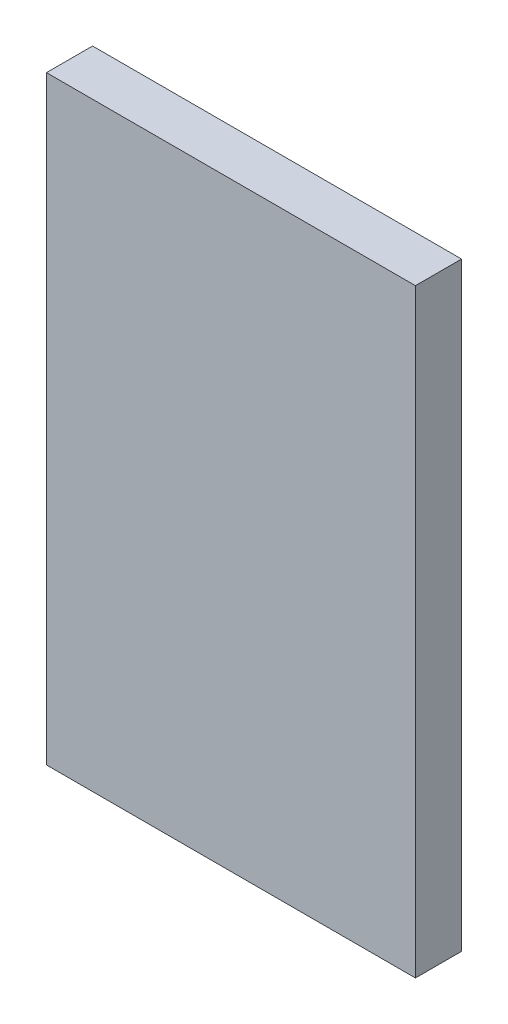
ISO-10303-21;
HEADER;
FILE_DESCRIPTION(('STEP AP214'),'2;1');
FILE_NAME('part.step','',(''),(''),'','','');
FILE_SCHEMA(('AUTOMOTIVE_DESIGN { 1 0 10303 214 1 1 1 1 }'));
ENDSEC;
DATA;
#1=APPLICATION_CONTEXT('core data for automotive mechanical design processes');
#2=APPLICATION_PROTOCOL_DEFINITION('international standard','automotive_design',2000,#1);
#3=PRODUCT_CONTEXT('',#1,'mechanical');
#4=PRODUCT('Part','Part','',(#3));
#5=PRODUCT_RELATED_PRODUCT_CATEGORY('part','',(#4));
#6=PRODUCT_DEFINITION_FORMATION('','',#4);
#7=PRODUCT_DEFINITION_CONTEXT('part definition',#1,'design');
#8=PRODUCT_DEFINITION('design','',#6,#7);
#9=PRODUCT_DEFINITION_SHAPE('','',#8);
#10=(LENGTH_UNIT() NAMED_UNIT(*) SI_UNIT(.MILLI.,.METRE.));
#11=(NAMED_UNIT(*) PLANE_ANGLE_UNIT() SI_UNIT($,.RADIAN.));
#12=(NAMED_UNIT(*) SI_UNIT($,.STERADIAN.) SOLID_ANGLE_UNIT());
#13=UNCERTAINTY_MEASURE_WITH_UNIT(LENGTH_MEASURE(1.E-05),#10,'distance_accuracy_value','');
#14=(GEOMETRIC_REPRESENTATION_CONTEXT(3) GLOBAL_UNCERTAINTY_ASSIGNED_CONTEXT((#13)) GLOBAL_UNIT_ASSIGNED_CONTEXT((#10,
#11,#12)) REPRESENTATION_CONTEXT('',''));
#15=CARTESIAN_POINT('',(0.,0.,0.));
#16=DIRECTION('',(0.,0.,1.));
#17=DIRECTION('',(1.,0.,0.));
#18=AXIS2_PLACEMENT_3D('',#15,#16,#17);
#19=CARTESIAN_POINT('',(-10.,0.,2.5));
#20=DIRECTION('',(1.,0.,0.));
#21=DIRECTION('',(0.,0.,-1.));
#22=AXIS2_PLACEMENT_3D('',#19,#20,#21);
#23=PLANE('',#22);
#24=DIRECTION('',(0.,-1.,0.));
#25=VECTOR('',#24,1.);
#26=CARTESIAN_POINT('',(-10.,0.,0.));
#27=LINE('',#26,#25);
#28=CARTESIAN_POINT('',(-10.,32.5,0.));
#29=VERTEX_POINT('',#28);
#30=CARTESIAN_POINT('',(-10.,0.,0.));
#31=VERTEX_POINT('',#30);
#32=EDGE_CURVE('E158',#29,#31,#27,.T.);
#33=ORIENTED_EDGE('',*,*,#32,.T.);
#34=DIRECTION('',(0.,0.,-1.));
#35=VECTOR('',#34,1.);
#36=CARTESIAN_POINT('',(-10.,0.,2.5));
#37=LINE('',#36,#35);
#38=CARTESIAN_POINT('',(-10.,0.,2.5));
#39=VERTEX_POINT('',#38);
#40=EDGE_CURVE('E139',#39,#31,#37,.T.);
#41=ORIENTED_EDGE('',*,*,#40,.F.);
#42=DIRECTION('',(0.,-1.,0.));
#43=VECTOR('',#42,1.);
#44=CARTESIAN_POINT('',(-10.,0.,2.5));
#45=LINE('',#44,#43);
#46=CARTESIAN_POINT('',(-10.,32.5,2.5));
#47=VERTEX_POINT('',#46);
#48=EDGE_CURVE('E146',#47,#39,#45,.T.);
#49=ORIENTED_EDGE('',*,*,#48,.F.);
#50=DIRECTION('',(0.,0.,-1.));
#51=VECTOR('',#50,1.);
#52=CARTESIAN_POINT('',(-10.,32.5,2.5));
#53=LINE('',#52,#51);
#54=EDGE_CURVE('E248',#47,#29,#53,.T.);
#55=ORIENTED_EDGE('',*,*,#54,.T.);
#56=EDGE_LOOP('',(#33,#41,#49,#55));
#57=FACE_BOUND('',#56,.T.);
#58=ADVANCED_FACE('F33',(#57),#23,.F.);
#59=CARTESIAN_POINT('',(-10.,0.,2.5));
#60=DIRECTION('',(0.,1.,0.));
#61=DIRECTION('',(0.,0.,1.));
#62=AXIS2_PLACEMENT_3D('',#59,#60,#61);
#63=PLANE('',#62);
#64=DIRECTION('',(0.,0.,1.));
#65=VECTOR('',#64,1.);
#66=CARTESIAN_POINT('',(1.5,0.,2.5));
#67=LINE('',#66,#65);
#68=CARTESIAN_POINT('',(1.5,0.,-1.));
#69=VERTEX_POINT('',#68);
#70=CARTESIAN_POINT('',(1.5,0.,0.));
#71=VERTEX_POINT('',#70);
#72=EDGE_CURVE('E178',#69,#71,#67,.T.);
#73=ORIENTED_EDGE('',*,*,#72,.T.);
#74=DIRECTION('',(1.,0.,0.));
#75=VECTOR('',#74,1.);
#76=CARTESIAN_POINT('',(-10.,0.,0.));
#77=LINE('',#76,#75);
#78=CARTESIAN_POINT('',(10.,0.,0.));
#79=VERTEX_POINT('',#78);
#80=EDGE_CURVE('E250',#71,#79,#77,.T.);
#81=ORIENTED_EDGE('',*,*,#80,.T.);
#82=DIRECTION('',(0.,0.,-1.));
#83=VECTOR('',#82,1.);
#84=CARTESIAN_POINT('',(10.,0.,2.5));
#85=LINE('',#84,#83);
#86=CARTESIAN_POINT('',(10.,0.,2.5));
#87=VERTEX_POINT('',#86);
#88=EDGE_CURVE('E142',#87,#79,#85,.T.);
#89=ORIENTED_EDGE('',*,*,#88,.F.);
#90=DIRECTION('',(1.,0.,0.));
#91=VECTOR('',#90,1.);
#92=CARTESIAN_POINT('',(-10.,0.,2.5));
#93=LINE('',#92,#91);
#94=EDGE_CURVE('E134',#39,#87,#93,.T.);
#95=ORIENTED_EDGE('',*,*,#94,.F.);
#96=ORIENTED_EDGE('',*,*,#40,.T.);
#97=CARTESIAN_POINT('',(-1.5,0.,0.));
#98=VERTEX_POINT('',#97);
#99=EDGE_CURVE('E251',#31,#98,#77,.T.);
#100=ORIENTED_EDGE('',*,*,#99,.T.);
#101=DIRECTION('',(0.,0.,1.));
#102=VECTOR('',#101,1.);
#103=CARTESIAN_POINT('',(-1.5,0.,2.5));
#104=LINE('',#103,#102);
#105=CARTESIAN_POINT('',(-1.5,0.,-1.));
#106=VERTEX_POINT('',#105);
#107=EDGE_CURVE('E173',#98,#106,#104,.F.);
#108=ORIENTED_EDGE('',*,*,#107,.T.);
#109=DIRECTION('',(-1.,0.,0.));
#110=VECTOR('',#109,1.);
#111=CARTESIAN_POINT('',(-10.,0.,-1.));
#112=LINE('',#111,#110);
#113=EDGE_CURVE('E175',#106,#69,#112,.F.);
#114=ORIENTED_EDGE('',*,*,#113,.T.);
#115=EDGE_LOOP('',(#73,#81,#89,#95,#96,#100,#108,#114));
#116=FACE_BOUND('',#115,.T.);
#117=ADVANCED_FACE('F137',(#116),#63,.F.);
#118=CARTESIAN_POINT('',(10.,0.,2.5));
#119=DIRECTION('',(-1.,0.,0.));
#120=DIRECTION('',(0.,0.,1.));
#121=AXIS2_PLACEMENT_3D('',#118,#119,#120);
#122=PLANE('',#121);
#123=DIRECTION('',(0.,1.,0.));
#124=VECTOR('',#123,1.);
#125=CARTESIAN_POINT('',(10.,0.,0.));
#126=LINE('',#125,#124);
#127=CARTESIAN_POINT('',(10.,32.5,0.));
#128=VERTEX_POINT('',#127);
#129=EDGE_CURVE('E253',#79,#128,#126,.T.);
#130=ORIENTED_EDGE('',*,*,#129,.T.);
#131=DIRECTION('',(0.,0.,-1.));
#132=VECTOR('',#131,1.);
#133=CARTESIAN_POINT('',(10.,32.5,2.5));
#134=LINE('',#133,#132);
#135=CARTESIAN_POINT('',(10.,32.5,2.5));
#136=VERTEX_POINT('',#135);
#137=EDGE_CURVE('E163',#136,#128,#134,.T.);
#138=ORIENTED_EDGE('',*,*,#137,.F.);
#139=DIRECTION('',(0.,1.,0.));
#140=VECTOR('',#139,1.);
#141=CARTESIAN_POINT('',(10.,0.,2.5));
#142=LINE('',#141,#140);
#143=EDGE_CURVE('E145',#87,#136,#142,.T.);
#144=ORIENTED_EDGE('',*,*,#143,.F.);
#145=ORIENTED_EDGE('',*,*,#88,.T.);
#146=EDGE_LOOP('',(#130,#138,#144,#145));
#147=FACE_BOUND('',#146,.T.);
#148=ADVANCED_FACE('F300',(#147),#122,.F.);
#149=CARTESIAN_POINT('',(-10.,32.5,2.5));
#150=DIRECTION('',(0.,-1.,0.));
#151=DIRECTION('',(0.,0.,-1.));
#152=AXIS2_PLACEMENT_3D('',#149,#150,#151);
#153=PLANE('',#152);
#154=DIRECTION('',(-1.,0.,0.));
#155=VECTOR('',#154,1.);
#156=CARTESIAN_POINT('',(-10.,32.5,0.));
#157=LINE('',#156,#155);
#158=EDGE_CURVE('E155',#128,#29,#157,.T.);
#159=ORIENTED_EDGE('',*,*,#158,.T.);
#160=ORIENTED_EDGE('',*,*,#54,.F.);
#161=DIRECTION('',(-1.,0.,0.));
#162=VECTOR('',#161,1.);
#163=CARTESIAN_POINT('',(-10.,32.5,2.5));
#164=LINE('',#163,#162);
#165=EDGE_CURVE('E151',#136,#47,#164,.T.);
#166=ORIENTED_EDGE('',*,*,#165,.F.);
#167=ORIENTED_EDGE('',*,*,#137,.T.);
#168=EDGE_LOOP('',(#159,#160,#166,#167));
#169=FACE_BOUND('',#168,.T.);
#170=ADVANCED_FACE('F260',(#169),#153,.F.);
#171=CARTESIAN_POINT('',(0.,0.,2.5));
#172=DIRECTION('',(0.,0.,-1.));
#173=DIRECTION('',(-1.,0.,0.));
#174=AXIS2_PLACEMENT_3D('',#171,#172,#173);
#175=PLANE('',#174);
#176=ORIENTED_EDGE('',*,*,#48,.T.);
#177=ORIENTED_EDGE('',*,*,#94,.T.);
#178=ORIENTED_EDGE('',*,*,#143,.T.);
#179=ORIENTED_EDGE('',*,*,#165,.T.);
#180=EDGE_LOOP('',(#176,#177,#178,#179));
#181=FACE_BOUND('',#180,.T.);
#182=ADVANCED_FACE('F149',(#181),#175,.F.);
#183=CARTESIAN_POINT('',(0.,0.,0.));
#184=DIRECTION('',(0.,0.,-1.));
#185=DIRECTION('',(-1.,0.,0.));
#186=AXIS2_PLACEMENT_3D('',#183,#184,#185);
#187=PLANE('',#186);
#188=DIRECTION('',(0.,-1.,0.));
#189=VECTOR('',#188,1.);
#190=CARTESIAN_POINT('',(2.5,0.,0.));
#191=LINE('',#190,#189);
#192=CARTESIAN_POINT('',(2.5,6.5,0.));
#193=VERTEX_POINT('',#192);
#194=CARTESIAN_POINT('',(2.5,1.,0.));
#195=VERTEX_POINT('',#194);
#196=EDGE_CURVE('E235',#193,#195,#191,.T.);
#197=ORIENTED_EDGE('',*,*,#196,.F.);
#198=CARTESIAN_POINT('',(1.5,6.5,0.));
#199=DIRECTION('',(0.,0.,-1.));
#200=DIRECTION('',(-1.,0.,0.));
#201=AXIS2_PLACEMENT_3D('',#198,#199,#200);
#202=CIRCLE('',#201,1.);
#203=CARTESIAN_POINT('',(1.5,7.5,0.));
#204=VERTEX_POINT('',#203);
#205=EDGE_CURVE('E11',#193,#204,#202,.F.);
#206=ORIENTED_EDGE('',*,*,#205,.T.);
#207=DIRECTION('',(1.,0.,0.));
#208=VECTOR('',#207,1.);
#209=CARTESIAN_POINT('',(2.5,7.5,0.));
#210=LINE('',#209,#208);
#211=CARTESIAN_POINT('',(-1.5,7.5,0.));
#212=VERTEX_POINT('',#211);
#213=EDGE_CURVE('E241',#212,#204,#210,.T.);
#214=ORIENTED_EDGE('',*,*,#213,.F.);
#215=CARTESIAN_POINT('',(-1.5,6.5,0.));
#216=DIRECTION('',(0.,0.,-1.));
#217=DIRECTION('',(-1.,0.,0.));
#218=AXIS2_PLACEMENT_3D('',#215,#216,#217);
#219=CIRCLE('',#218,1.);
#220=CARTESIAN_POINT('',(-2.5,6.5,0.));
#221=VERTEX_POINT('',#220);
#222=EDGE_CURVE('E42',#212,#221,#219,.F.);
#223=ORIENTED_EDGE('',*,*,#222,.T.);
#224=DIRECTION('',(0.,1.,0.));
#225=VECTOR('',#224,1.);
#226=CARTESIAN_POINT('',(-2.5,0.,0.));
#227=LINE('',#226,#225);
#228=CARTESIAN_POINT('',(-2.5,1.,0.));
#229=VERTEX_POINT('',#228);
#230=EDGE_CURVE('E237',#229,#221,#227,.T.);
#231=ORIENTED_EDGE('',*,*,#230,.F.);
#232=CARTESIAN_POINT('',(-1.5,1.,0.));
#233=DIRECTION('',(0.,0.,-1.));
#234=DIRECTION('',(-1.,0.,0.));
#235=AXIS2_PLACEMENT_3D('',#232,#233,#234);
#236=CIRCLE('',#235,1.);
#237=EDGE_CURVE('E198',#229,#98,#236,.F.);
#238=ORIENTED_EDGE('',*,*,#237,.T.);
#239=ORIENTED_EDGE('',*,*,#99,.F.);
#240=ORIENTED_EDGE('',*,*,#32,.F.);
#241=ORIENTED_EDGE('',*,*,#158,.F.);
#242=ORIENTED_EDGE('',*,*,#129,.F.);
#243=ORIENTED_EDGE('',*,*,#80,.F.);
#244=CARTESIAN_POINT('',(1.5,1.,0.));
#245=DIRECTION('',(0.,0.,-1.));
#246=DIRECTION('',(-1.,0.,0.));
#247=AXIS2_PLACEMENT_3D('',#244,#245,#246);
#248=CIRCLE('',#247,1.);
#249=EDGE_CURVE('E196',#71,#195,#248,.F.);
#250=ORIENTED_EDGE('',*,*,#249,.T.);
#251=EDGE_LOOP('',(#197,#206,#214,#223,#231,#238,#239,#240,#241,#242,#243,#250));
#252=FACE_BOUND('',#251,.T.);
#253=ADVANCED_FACE('F264',(#252),#187,.T.);
#254=CARTESIAN_POINT('',(2.5,0.,-2.));
#255=DIRECTION('',(-1.,0.,0.));
#256=DIRECTION('',(0.,0.,1.));
#257=AXIS2_PLACEMENT_3D('',#254,#255,#256);
#258=PLANE('',#257);
#259=ORIENTED_EDGE('',*,*,#196,.T.);
#260=DIRECTION('',(0.,0.,1.));
#261=VECTOR('',#260,1.);
#262=CARTESIAN_POINT('',(2.5,1.,-2.));
#263=LINE('',#262,#261);
#264=CARTESIAN_POINT('',(2.5,1.,-1.));
#265=VERTEX_POINT('',#264);
#266=EDGE_CURVE('E50',#195,#265,#263,.F.);
#267=ORIENTED_EDGE('',*,*,#266,.T.);
#268=DIRECTION('',(0.,-1.,0.));
#269=VECTOR('',#268,1.);
#270=CARTESIAN_POINT('',(2.5,0.,-1.));
#271=LINE('',#270,#269);
#272=CARTESIAN_POINT('',(2.5,6.5,-1.));
#273=VERTEX_POINT('',#272);
#274=EDGE_CURVE('E54',#265,#273,#271,.F.);
#275=ORIENTED_EDGE('',*,*,#274,.T.);
#276=DIRECTION('',(0.,0.,1.));
#277=VECTOR('',#276,1.);
#278=CARTESIAN_POINT('',(2.5,6.5,-2.));
#279=LINE('',#278,#277);
#280=EDGE_CURVE('E192',#273,#193,#279,.T.);
#281=ORIENTED_EDGE('',*,*,#280,.T.);
#282=EDGE_LOOP('',(#259,#267,#275,#281));
#283=FACE_BOUND('',#282,.T.);
#284=ADVANCED_FACE('F356',(#283),#258,.F.);
#285=CARTESIAN_POINT('',(-2.5,0.,-2.));
#286=DIRECTION('',(1.,0.,0.));
#287=DIRECTION('',(0.,0.,-1.));
#288=AXIS2_PLACEMENT_3D('',#285,#286,#287);
#289=PLANE('',#288);
#290=DIRECTION('',(0.,1.,0.));
#291=VECTOR('',#290,1.);
#292=CARTESIAN_POINT('',(-2.5,0.,-1.));
#293=LINE('',#292,#291);
#294=CARTESIAN_POINT('',(-2.5,6.5,-1.));
#295=VERTEX_POINT('',#294);
#296=CARTESIAN_POINT('',(-2.5,1.,-1.));
#297=VERTEX_POINT('',#296);
#298=EDGE_CURVE('E182',#295,#297,#293,.F.);
#299=ORIENTED_EDGE('',*,*,#298,.T.);
#300=DIRECTION('',(0.,0.,1.));
#301=VECTOR('',#300,1.);
#302=CARTESIAN_POINT('',(-2.5,1.,-2.));
#303=LINE('',#302,#301);
#304=EDGE_CURVE('E184',#297,#229,#303,.T.);
#305=ORIENTED_EDGE('',*,*,#304,.T.);
#306=ORIENTED_EDGE('',*,*,#230,.T.);
#307=DIRECTION('',(0.,0.,1.));
#308=VECTOR('',#307,1.);
#309=CARTESIAN_POINT('',(-2.5,6.5,-2.));
#310=LINE('',#309,#308);
#311=EDGE_CURVE('E180',#221,#295,#310,.F.);
#312=ORIENTED_EDGE('',*,*,#311,.T.);
#313=EDGE_LOOP('',(#299,#305,#306,#312));
#314=FACE_BOUND('',#313,.T.);
#315=ADVANCED_FACE('F358',(#314),#289,.F.);
#316=CARTESIAN_POINT('',(2.5,7.5,-2.));
#317=DIRECTION('',(0.,-1.,0.));
#318=DIRECTION('',(0.,0.,-1.));
#319=AXIS2_PLACEMENT_3D('',#316,#317,#318);
#320=PLANE('',#319);
#321=DIRECTION('',(1.,0.,0.));
#322=VECTOR('',#321,1.);
#323=CARTESIAN_POINT('',(2.5,7.5,-1.));
#324=LINE('',#323,#322);
#325=CARTESIAN_POINT('',(1.5,7.5,-1.));
#326=VERTEX_POINT('',#325);
#327=CARTESIAN_POINT('',(-1.5,7.5,-1.));
#328=VERTEX_POINT('',#327);
#329=EDGE_CURVE('E188',#326,#328,#324,.F.);
#330=ORIENTED_EDGE('',*,*,#329,.T.);
#331=DIRECTION('',(0.,0.,1.));
#332=VECTOR('',#331,1.);
#333=CARTESIAN_POINT('',(-1.5,7.5,-2.));
#334=LINE('',#333,#332);
#335=EDGE_CURVE('E190',#328,#212,#334,.T.);
#336=ORIENTED_EDGE('',*,*,#335,.T.);
#337=ORIENTED_EDGE('',*,*,#213,.T.);
#338=DIRECTION('',(0.,0.,1.));
#339=VECTOR('',#338,1.);
#340=CARTESIAN_POINT('',(1.5,7.5,-2.));
#341=LINE('',#340,#339);
#342=EDGE_CURVE('E186',#204,#326,#341,.F.);
#343=ORIENTED_EDGE('',*,*,#342,.T.);
#344=EDGE_LOOP('',(#330,#336,#337,#343));
#345=FACE_BOUND('',#344,.T.);
#346=ADVANCED_FACE('F353',(#345),#320,.F.);
#347=CARTESIAN_POINT('',(0.,0.,-2.));
#348=DIRECTION('',(0.,0.,1.));
#349=DIRECTION('',(1.,0.,0.));
#350=AXIS2_PLACEMENT_3D('',#347,#348,#349);
#351=PLANE('',#350);
#352=DIRECTION('',(0.,-1.,0.));
#353=VECTOR('',#352,1.);
#354=CARTESIAN_POINT('',(1.5,0.,-2.));
#355=LINE('',#354,#353);
#356=CARTESIAN_POINT('',(1.5,6.5,-2.));
#357=VERTEX_POINT('',#356);
#358=CARTESIAN_POINT('',(1.5,1.,-2.));
#359=VERTEX_POINT('',#358);
#360=EDGE_CURVE('E159',#357,#359,#355,.T.);
#361=ORIENTED_EDGE('',*,*,#360,.T.);
#362=DIRECTION('',(-1.,0.,0.));
#363=VECTOR('',#362,1.);
#364=CARTESIAN_POINT('',(0.,1.,-2.));
#365=LINE('',#364,#363);
#366=CARTESIAN_POINT('',(-1.5,1.,-2.));
#367=VERTEX_POINT('',#366);
#368=EDGE_CURVE('E170',#359,#367,#365,.T.);
#369=ORIENTED_EDGE('',*,*,#368,.T.);
#370=DIRECTION('',(0.,1.,0.));
#371=VECTOR('',#370,1.);
#372=CARTESIAN_POINT('',(-1.5,0.,-2.));
#373=LINE('',#372,#371);
#374=CARTESIAN_POINT('',(-1.5,6.5,-2.));
#375=VERTEX_POINT('',#374);
#376=EDGE_CURVE('E168',#367,#375,#373,.T.);
#377=ORIENTED_EDGE('',*,*,#376,.T.);
#378=DIRECTION('',(1.,0.,0.));
#379=VECTOR('',#378,1.);
#380=CARTESIAN_POINT('',(0.,6.5,-2.));
#381=LINE('',#380,#379);
#382=EDGE_CURVE('E161',#375,#357,#381,.T.);
#383=ORIENTED_EDGE('',*,*,#382,.T.);
#384=EDGE_LOOP('',(#361,#369,#377,#383));
#385=FACE_BOUND('',#384,.T.);
#386=ADVANCED_FACE('F288',(#385),#351,.F.);
#387=CARTESIAN_POINT('',(1.5,6.5,-2.));
#388=DIRECTION('',(0.,0.,1.));
#389=DIRECTION('',(1.,0.,0.));
#390=AXIS2_PLACEMENT_3D('',#387,#388,#389);
#391=CYLINDRICAL_SURFACE('',#390,1.);
#392=ORIENTED_EDGE('',*,*,#205,.F.);
#393=ORIENTED_EDGE('',*,*,#280,.F.);
#394=CARTESIAN_POINT('',(1.5,6.5,-1.));
#395=DIRECTION('',(0.,0.,-1.));
#396=DIRECTION('',(-1.,0.,0.));
#397=AXIS2_PLACEMENT_3D('',#394,#395,#396);
#398=CIRCLE('',#397,1.);
#399=EDGE_CURVE('E37',#326,#273,#398,.T.);
#400=ORIENTED_EDGE('',*,*,#399,.F.);
#401=ORIENTED_EDGE('',*,*,#342,.F.);
#402=EDGE_LOOP('',(#392,#393,#400,#401));
#403=FACE_BOUND('',#402,.T.);
#404=ADVANCED_FACE('F35',(#403),#391,.T.);
#405=CARTESIAN_POINT('',(0.,6.5,-1.));
#406=DIRECTION('',(1.,0.,0.));
#407=DIRECTION('',(0.,0.,-1.));
#408=AXIS2_PLACEMENT_3D('',#405,#406,#407);
#409=CYLINDRICAL_SURFACE('',#408,1.);
#410=CARTESIAN_POINT('',(-1.5,6.5,-1.));
#411=DIRECTION('',(-1.,0.,0.));
#412=DIRECTION('',(0.,0.,1.));
#413=AXIS2_PLACEMENT_3D('',#410,#411,#412);
#414=CIRCLE('',#413,1.);
#415=EDGE_CURVE('E227',#328,#375,#414,.T.);
#416=ORIENTED_EDGE('',*,*,#415,.F.);
#417=ORIENTED_EDGE('',*,*,#329,.F.);
#418=CARTESIAN_POINT('',(1.5,6.5,-1.));
#419=DIRECTION('',(1.,0.,0.));
#420=DIRECTION('',(0.,0.,-1.));
#421=AXIS2_PLACEMENT_3D('',#418,#419,#420);
#422=CIRCLE('',#421,1.);
#423=EDGE_CURVE('E229',#357,#326,#422,.T.);
#424=ORIENTED_EDGE('',*,*,#423,.F.);
#425=ORIENTED_EDGE('',*,*,#382,.F.);
#426=EDGE_LOOP('',(#416,#417,#424,#425));
#427=FACE_BOUND('',#426,.T.);
#428=ADVANCED_FACE('F337',(#427),#409,.T.);
#429=CARTESIAN_POINT('',(-1.5,6.5,-2.));
#430=DIRECTION('',(0.,0.,1.));
#431=DIRECTION('',(1.,0.,0.));
#432=AXIS2_PLACEMENT_3D('',#429,#430,#431);
#433=CYLINDRICAL_SURFACE('',#432,1.);
#434=ORIENTED_EDGE('',*,*,#222,.F.);
#435=ORIENTED_EDGE('',*,*,#335,.F.);
#436=CARTESIAN_POINT('',(-1.5,6.5,-1.));
#437=DIRECTION('',(0.,0.,-1.));
#438=DIRECTION('',(-1.,0.,0.));
#439=AXIS2_PLACEMENT_3D('',#436,#437,#438);
#440=CIRCLE('',#439,1.);
#441=EDGE_CURVE('E224',#295,#328,#440,.T.);
#442=ORIENTED_EDGE('',*,*,#441,.F.);
#443=ORIENTED_EDGE('',*,*,#311,.F.);
#444=EDGE_LOOP('',(#434,#435,#442,#443));
#445=FACE_BOUND('',#444,.T.);
#446=ADVANCED_FACE('F335',(#445),#433,.T.);
#447=CARTESIAN_POINT('',(1.5,6.5,-1.));
#448=DIRECTION('',(0.,0.,1.));
#449=DIRECTION('',(1.,0.,0.));
#450=AXIS2_PLACEMENT_3D('',#447,#448,#449);
#451=SPHERICAL_SURFACE('',#450,1.);
#452=ORIENTED_EDGE('',*,*,#423,.T.);
#453=ORIENTED_EDGE('',*,*,#399,.T.);
#454=CARTESIAN_POINT('',(1.5,6.5,-1.));
#455=DIRECTION('',(0.,1.,0.));
#456=DIRECTION('',(0.,0.,1.));
#457=AXIS2_PLACEMENT_3D('',#454,#455,#456);
#458=CIRCLE('',#457,1.);
#459=EDGE_CURVE('E221',#357,#273,#458,.F.);
#460=ORIENTED_EDGE('',*,*,#459,.F.);
#461=EDGE_LOOP('',(#452,#453,#460));
#462=FACE_BOUND('',#461,.T.);
#463=ADVANCED_FACE('F331',(#462),#451,.T.);
#464=CARTESIAN_POINT('',(-1.5,6.5,-1.));
#465=DIRECTION('',(0.,0.,1.));
#466=DIRECTION('',(1.,0.,0.));
#467=AXIS2_PLACEMENT_3D('',#464,#465,#466);
#468=SPHERICAL_SURFACE('',#467,1.);
#469=ORIENTED_EDGE('',*,*,#441,.T.);
#470=ORIENTED_EDGE('',*,*,#415,.T.);
#471=CARTESIAN_POINT('',(-1.5,6.5,-1.));
#472=DIRECTION('',(0.,1.,0.));
#473=DIRECTION('',(0.,0.,1.));
#474=AXIS2_PLACEMENT_3D('',#471,#472,#473);
#475=CIRCLE('',#474,1.);
#476=EDGE_CURVE('E218',#295,#375,#475,.F.);
#477=ORIENTED_EDGE('',*,*,#476,.F.);
#478=EDGE_LOOP('',(#469,#470,#477));
#479=FACE_BOUND('',#478,.T.);
#480=ADVANCED_FACE('F328',(#479),#468,.T.);
#481=CARTESIAN_POINT('',(1.5,1.,2.5));
#482=DIRECTION('',(0.,0.,1.));
#483=DIRECTION('',(1.,0.,0.));
#484=AXIS2_PLACEMENT_3D('',#481,#482,#483);
#485=CYLINDRICAL_SURFACE('',#484,1.);
#486=ORIENTED_EDGE('',*,*,#249,.F.);
#487=ORIENTED_EDGE('',*,*,#72,.F.);
#488=CARTESIAN_POINT('',(1.5,1.,-1.));
#489=DIRECTION('',(0.,0.,-1.));
#490=DIRECTION('',(-1.,0.,0.));
#491=AXIS2_PLACEMENT_3D('',#488,#489,#490);
#492=CIRCLE('',#491,1.);
#493=EDGE_CURVE('E215',#265,#69,#492,.T.);
#494=ORIENTED_EDGE('',*,*,#493,.F.);
#495=ORIENTED_EDGE('',*,*,#266,.F.);
#496=EDGE_LOOP('',(#486,#487,#494,#495));
#497=FACE_BOUND('',#496,.T.);
#498=ADVANCED_FACE('F299',(#497),#485,.T.);
#499=CARTESIAN_POINT('',(1.5,0.,-1.));
#500=DIRECTION('',(0.,-1.,0.));
#501=DIRECTION('',(0.,0.,-1.));
#502=AXIS2_PLACEMENT_3D('',#499,#500,#501);
#503=CYLINDRICAL_SURFACE('',#502,1.);
#504=ORIENTED_EDGE('',*,*,#459,.T.);
#505=ORIENTED_EDGE('',*,*,#274,.F.);
#506=CARTESIAN_POINT('',(1.5,1.,-1.));
#507=DIRECTION('',(0.,-1.,0.));
#508=DIRECTION('',(0.,0.,-1.));
#509=AXIS2_PLACEMENT_3D('',#506,#507,#508);
#510=CIRCLE('',#509,1.);
#511=EDGE_CURVE('E212',#359,#265,#510,.T.);
#512=ORIENTED_EDGE('',*,*,#511,.F.);
#513=ORIENTED_EDGE('',*,*,#360,.F.);
#514=EDGE_LOOP('',(#504,#505,#512,#513));
#515=FACE_BOUND('',#514,.T.);
#516=ADVANCED_FACE('F292',(#515),#503,.T.);
#517=CARTESIAN_POINT('',(-1.5,0.,-1.));
#518=DIRECTION('',(0.,1.,0.));
#519=DIRECTION('',(0.,0.,1.));
#520=AXIS2_PLACEMENT_3D('',#517,#518,#519);
#521=CYLINDRICAL_SURFACE('',#520,1.);
#522=ORIENTED_EDGE('',*,*,#476,.T.);
#523=ORIENTED_EDGE('',*,*,#376,.F.);
#524=CARTESIAN_POINT('',(-1.5,1.,-1.));
#525=DIRECTION('',(0.,-1.,0.));
#526=DIRECTION('',(0.,0.,-1.));
#527=AXIS2_PLACEMENT_3D('',#524,#525,#526);
#528=CIRCLE('',#527,1.);
#529=EDGE_CURVE('E209',#297,#367,#528,.T.);
#530=ORIENTED_EDGE('',*,*,#529,.F.);
#531=ORIENTED_EDGE('',*,*,#298,.F.);
#532=EDGE_LOOP('',(#522,#523,#530,#531));
#533=FACE_BOUND('',#532,.T.);
#534=ADVANCED_FACE('F284',(#533),#521,.T.);
#535=CARTESIAN_POINT('',(-1.5,1.,-2.));
#536=DIRECTION('',(0.,0.,1.));
#537=DIRECTION('',(1.,0.,0.));
#538=AXIS2_PLACEMENT_3D('',#535,#536,#537);
#539=CYLINDRICAL_SURFACE('',#538,1.);
#540=ORIENTED_EDGE('',*,*,#237,.F.);
#541=ORIENTED_EDGE('',*,*,#304,.F.);
#542=CARTESIAN_POINT('',(-1.5,1.,-1.));
#543=DIRECTION('',(0.,0.,-1.));
#544=DIRECTION('',(-1.,0.,0.));
#545=AXIS2_PLACEMENT_3D('',#542,#543,#544);
#546=CIRCLE('',#545,1.);
#547=EDGE_CURVE('E206',#106,#297,#546,.T.);
#548=ORIENTED_EDGE('',*,*,#547,.F.);
#549=ORIENTED_EDGE('',*,*,#107,.F.);
#550=EDGE_LOOP('',(#540,#541,#548,#549));
#551=FACE_BOUND('',#550,.T.);
#552=ADVANCED_FACE('F272',(#551),#539,.T.);
#553=CARTESIAN_POINT('',(1.5,1.,-1.));
#554=DIRECTION('',(0.,0.,1.));
#555=DIRECTION('',(1.,0.,0.));
#556=AXIS2_PLACEMENT_3D('',#553,#554,#555);
#557=SPHERICAL_SURFACE('',#556,1.);
#558=ORIENTED_EDGE('',*,*,#511,.T.);
#559=ORIENTED_EDGE('',*,*,#493,.T.);
#560=CARTESIAN_POINT('',(1.5,1.,-1.));
#561=DIRECTION('',(1.,0.,0.));
#562=DIRECTION('',(0.,0.,-1.));
#563=AXIS2_PLACEMENT_3D('',#560,#561,#562);
#564=CIRCLE('',#563,1.);
#565=EDGE_CURVE('E204',#359,#69,#564,.F.);
#566=ORIENTED_EDGE('',*,*,#565,.F.);
#567=EDGE_LOOP('',(#558,#559,#566));
#568=FACE_BOUND('',#567,.T.);
#569=ADVANCED_FACE('F295',(#568),#557,.T.);
#570=CARTESIAN_POINT('',(-1.5,1.,-1.));
#571=DIRECTION('',(0.,0.,1.));
#572=DIRECTION('',(1.,0.,0.));
#573=AXIS2_PLACEMENT_3D('',#570,#571,#572);
#574=SPHERICAL_SURFACE('',#573,1.);
#575=ORIENTED_EDGE('',*,*,#547,.T.);
#576=ORIENTED_EDGE('',*,*,#529,.T.);
#577=CARTESIAN_POINT('',(-1.5,1.,-1.));
#578=DIRECTION('',(-1.,0.,0.));
#579=DIRECTION('',(0.,0.,1.));
#580=AXIS2_PLACEMENT_3D('',#577,#578,#579);
#581=CIRCLE('',#580,1.);
#582=EDGE_CURVE('E202',#106,#367,#581,.F.);
#583=ORIENTED_EDGE('',*,*,#582,.F.);
#584=EDGE_LOOP('',(#575,#576,#583));
#585=FACE_BOUND('',#584,.T.);
#586=ADVANCED_FACE('F280',(#585),#574,.T.);
#587=CARTESIAN_POINT('',(0.,1.,-1.));
#588=DIRECTION('',(-1.,0.,0.));
#589=DIRECTION('',(0.,0.,1.));
#590=AXIS2_PLACEMENT_3D('',#587,#588,#589);
#591=CYLINDRICAL_SURFACE('',#590,1.);
#592=ORIENTED_EDGE('',*,*,#565,.T.);
#593=ORIENTED_EDGE('',*,*,#113,.F.);
#594=ORIENTED_EDGE('',*,*,#582,.T.);
#595=ORIENTED_EDGE('',*,*,#368,.F.);
#596=EDGE_LOOP('',(#592,#593,#594,#595));
#597=FACE_BOUND('',#596,.T.);
#598=ADVANCED_FACE('F277',(#597),#591,.T.);
#599=CLOSED_SHELL('',(#58,#117,#148,#170,#182,#253,#284,#315,#346,#386,#404,#428,#446,#463,#480,
#498,#516,#534,#552,#569,#586,#598));
#600=MANIFOLD_SOLID_BREP('B2',#599);
#601=ADVANCED_BREP_SHAPE_REPRESENTATION('',(#18,#600),#14);
#602=SHAPE_DEFINITION_REPRESENTATION(#9,#601);
ENDSEC;
END-ISO-10303-21;
